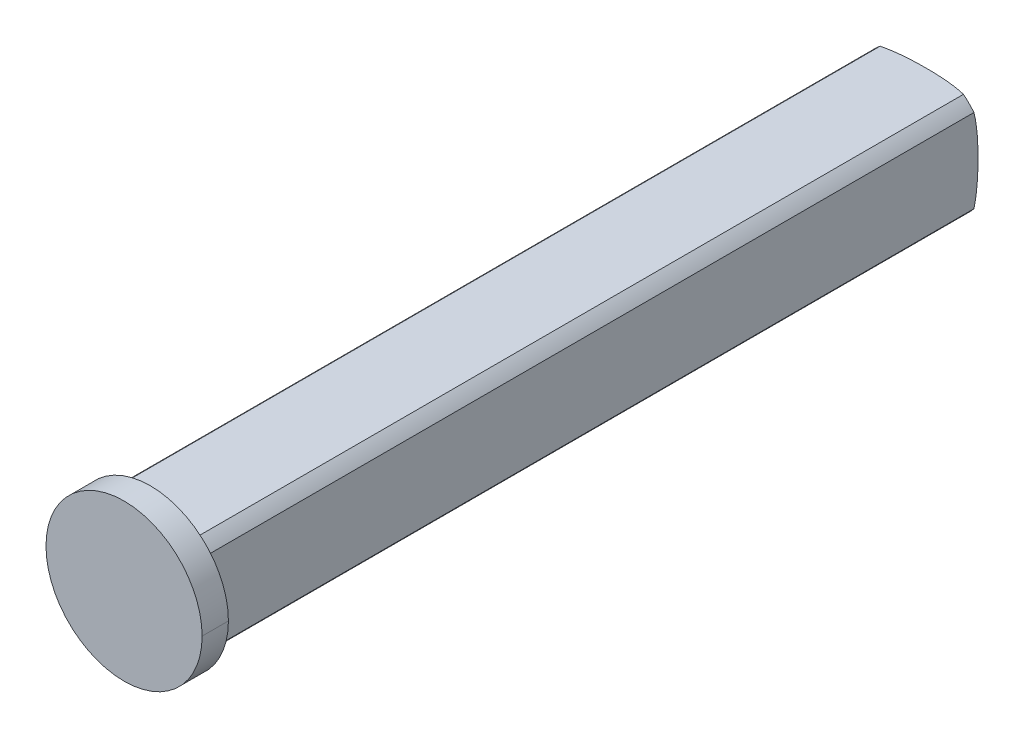
ISO-10303-21;
HEADER;
FILE_DESCRIPTION(('STEP AP214'),'2;1');
FILE_NAME('part.step','',(''),(''),'','','');
FILE_SCHEMA(('AUTOMOTIVE_DESIGN { 1 0 10303 214 1 1 1 1 }'));
ENDSEC;
DATA;
#1=APPLICATION_CONTEXT('core data for automotive mechanical design processes');
#2=APPLICATION_PROTOCOL_DEFINITION('international standard','automotive_design',2000,#1);
#3=PRODUCT_CONTEXT('',#1,'mechanical');
#4=PRODUCT('Part','Part','',(#3));
#5=PRODUCT_RELATED_PRODUCT_CATEGORY('part','',(#4));
#6=PRODUCT_DEFINITION_FORMATION('','',#4);
#7=PRODUCT_DEFINITION_CONTEXT('part definition',#1,'design');
#8=PRODUCT_DEFINITION('design','',#6,#7);
#9=PRODUCT_DEFINITION_SHAPE('','',#8);
#10=(LENGTH_UNIT() NAMED_UNIT(*) SI_UNIT(.MILLI.,.METRE.));
#11=(NAMED_UNIT(*) PLANE_ANGLE_UNIT() SI_UNIT($,.RADIAN.));
#12=(NAMED_UNIT(*) SI_UNIT($,.STERADIAN.) SOLID_ANGLE_UNIT());
#13=UNCERTAINTY_MEASURE_WITH_UNIT(LENGTH_MEASURE(1.E-05),#10,'distance_accuracy_value','');
#14=(GEOMETRIC_REPRESENTATION_CONTEXT(3) GLOBAL_UNCERTAINTY_ASSIGNED_CONTEXT((#13)) GLOBAL_UNIT_ASSIGNED_CONTEXT((#10,
#11,#12)) REPRESENTATION_CONTEXT('',''));
#15=CARTESIAN_POINT('',(0.,0.,0.));
#16=DIRECTION('',(0.,0.,1.));
#17=DIRECTION('',(1.,0.,0.));
#18=AXIS2_PLACEMENT_3D('',#15,#16,#17);
#19=CARTESIAN_POINT('',(0.,0.,0.));
#20=DIRECTION('',(0.,0.,1.));
#21=DIRECTION('',(1.,0.,0.));
#22=AXIS2_PLACEMENT_3D('',#19,#20,#21);
#23=PLANE('',#22);
#24=CARTESIAN_POINT('',(0.,0.,0.));
#25=DIRECTION('',(0.,0.,1.));
#26=DIRECTION('',(1.,0.,0.));
#27=AXIS2_PLACEMENT_3D('',#24,#25,#26);
#28=CIRCLE('',#27,2.375);
#29=CARTESIAN_POINT('',(-2.375,0.,0.));
#30=VERTEX_POINT('',#29);
#31=CARTESIAN_POINT('',(2.375,0.,0.));
#32=VERTEX_POINT('',#31);
#33=EDGE_CURVE('P0_E10',#30,#32,#28,.T.);
#34=ORIENTED_EDGE('',*,*,#33,.F.);
#35=CARTESIAN_POINT('',(0.,0.,0.));
#36=DIRECTION('',(0.,0.,1.));
#37=DIRECTION('',(1.,0.,0.));
#38=AXIS2_PLACEMENT_3D('',#35,#36,#37);
#39=CIRCLE('',#38,2.375);
#40=EDGE_CURVE('P0_E64',#32,#30,#39,.T.);
#41=ORIENTED_EDGE('',*,*,#40,.F.);
#42=EDGE_LOOP('',(#34,#41));
#43=FACE_BOUND('',#42,.T.);
#44=ADVANCED_FACE('P0_F16',(#43),#23,.F.);
#45=CARTESIAN_POINT('',(0.,0.,0.8));
#46=DIRECTION('',(0.,0.,1.));
#47=DIRECTION('',(1.,0.,0.));
#48=AXIS2_PLACEMENT_3D('',#45,#46,#47);
#49=PLANE('',#48);
#50=CARTESIAN_POINT('',(0.,0.,0.8));
#51=DIRECTION('',(0.,0.,1.));
#52=DIRECTION('',(1.,0.,0.));
#53=AXIS2_PLACEMENT_3D('',#50,#51,#52);
#54=CIRCLE('',#53,2.375);
#55=CARTESIAN_POINT('',(-2.375,0.,0.8));
#56=VERTEX_POINT('',#55);
#57=CARTESIAN_POINT('',(2.375,0.,0.8));
#58=VERTEX_POINT('',#57);
#59=EDGE_CURVE('P0_E25',#56,#58,#54,.T.);
#60=ORIENTED_EDGE('',*,*,#59,.T.);
#61=CARTESIAN_POINT('',(0.,0.,0.8));
#62=DIRECTION('',(0.,0.,1.));
#63=DIRECTION('',(1.,0.,0.));
#64=AXIS2_PLACEMENT_3D('',#61,#62,#63);
#65=CIRCLE('',#64,2.375);
#66=EDGE_CURVE('P0_E63',#58,#56,#65,.T.);
#67=ORIENTED_EDGE('',*,*,#66,.T.);
#68=EDGE_LOOP('',(#60,#67));
#69=FACE_BOUND('',#68,.T.);
#70=ADVANCED_FACE('P0_F67',(#69),#49,.T.);
#71=CARTESIAN_POINT('',(0.,0.,0.8));
#72=DIRECTION('',(0.,0.,-1.));
#73=DIRECTION('',(-1.,0.,0.));
#74=AXIS2_PLACEMENT_3D('',#71,#72,#73);
#75=CYLINDRICAL_SURFACE('',#74,2.375);
#76=DIRECTION('',(0.,0.,-1.));
#77=VECTOR('',#76,1.);
#78=CARTESIAN_POINT('',(2.375,0.,0.8));
#79=LINE('',#78,#77);
#80=EDGE_CURVE('P0_E57',#58,#32,#79,.T.);
#81=ORIENTED_EDGE('',*,*,#80,.F.);
#82=ORIENTED_EDGE('',*,*,#59,.F.);
#83=DIRECTION('',(0.,0.,-1.));
#84=VECTOR('',#83,1.);
#85=CARTESIAN_POINT('',(-2.375,0.,0.8));
#86=LINE('',#85,#84);
#87=EDGE_CURVE('P0_E54',#56,#30,#86,.T.);
#88=ORIENTED_EDGE('',*,*,#87,.T.);
#89=ORIENTED_EDGE('',*,*,#33,.T.);
#90=EDGE_LOOP('',(#81,#82,#88,#89));
#91=FACE_BOUND('',#90,.T.);
#92=ADVANCED_FACE('P0_F53',(#91),#75,.T.);
#93=CARTESIAN_POINT('',(0.,0.,0.8));
#94=DIRECTION('',(0.,0.,-1.));
#95=DIRECTION('',(-1.,0.,0.));
#96=AXIS2_PLACEMENT_3D('',#93,#94,#95);
#97=CYLINDRICAL_SURFACE('',#96,2.375);
#98=ORIENTED_EDGE('',*,*,#66,.F.);
#99=ORIENTED_EDGE('',*,*,#80,.T.);
#100=ORIENTED_EDGE('',*,*,#40,.T.);
#101=ORIENTED_EDGE('',*,*,#87,.F.);
#102=EDGE_LOOP('',(#98,#99,#100,#101));
#103=FACE_BOUND('',#102,.T.);
#104=ADVANCED_FACE('P0_F62',(#103),#97,.T.);
#105=CLOSED_SHELL('',(#44,#70,#92,#104));
#106=MANIFOLD_SOLID_BREP('P0_B1',#105);
#107=CARTESIAN_POINT('',(0.,0.,-23.622));
#108=DIRECTION('',(0.,0.,1.));
#109=DIRECTION('',(1.,0.,0.));
#110=AXIS2_PLACEMENT_3D('',#107,#108,#109);
#111=CYLINDRICAL_SURFACE('',#110,2.032);
#112=DIRECTION('',(0.,0.,-1.));
#113=VECTOR('',#112,1.);
#114=CARTESIAN_POINT('',(1.5875,1.26841150657032,-23.622));
#115=LINE('',#114,#113);
#116=CARTESIAN_POINT('',(1.5875,1.26841150657032,0.));
#117=VERTEX_POINT('',#116);
#118=CARTESIAN_POINT('',(1.5875,1.26841150657032,-23.470919142098));
#119=VERTEX_POINT('',#118);
#120=EDGE_CURVE('P1_E333',#117,#119,#115,.T.);
#121=ORIENTED_EDGE('',*,*,#120,.T.);
#122=CARTESIAN_POINT('',(0.,0.,-23.470919142098));
#123=DIRECTION('',(0.,0.,1.));
#124=DIRECTION('',(1.,0.,0.));
#125=AXIS2_PLACEMENT_3D('',#122,#123,#124);
#126=CIRCLE('',#125,2.032);
#127=CARTESIAN_POINT('',(1.26841150657032,1.5875,-23.470919142098));
#128=VERTEX_POINT('',#127);
#129=EDGE_CURVE('P1_E154',#119,#128,#126,.T.);
#130=ORIENTED_EDGE('',*,*,#129,.T.);
#131=DIRECTION('',(0.,0.,1.));
#132=VECTOR('',#131,1.);
#133=CARTESIAN_POINT('',(1.26841150657032,1.5875,-23.622));
#134=LINE('',#133,#132);
#135=CARTESIAN_POINT('',(1.26841150657032,1.5875,0.));
#136=VERTEX_POINT('',#135);
#137=EDGE_CURVE('P1_E142',#128,#136,#134,.T.);
#138=ORIENTED_EDGE('',*,*,#137,.T.);
#139=CARTESIAN_POINT('',(0.,0.,0.));
#140=DIRECTION('',(0.,0.,1.));
#141=DIRECTION('',(1.,0.,0.));
#142=AXIS2_PLACEMENT_3D('',#139,#140,#141);
#143=CIRCLE('',#142,2.032);
#144=EDGE_CURVE('P1_E309',#117,#136,#143,.T.);
#145=ORIENTED_EDGE('',*,*,#144,.F.);
#146=EDGE_LOOP('',(#121,#130,#138,#145));
#147=FACE_BOUND('',#146,.T.);
#148=ADVANCED_FACE('P1_F17',(#147),#111,.T.);
#149=CARTESIAN_POINT('',(0.,0.,-23.622));
#150=DIRECTION('',(0.,0.,1.));
#151=DIRECTION('',(1.,0.,0.));
#152=AXIS2_PLACEMENT_3D('',#149,#150,#151);
#153=CYLINDRICAL_SURFACE('',#152,2.032);
#154=DIRECTION('',(0.,0.,1.));
#155=VECTOR('',#154,1.);
#156=CARTESIAN_POINT('',(-1.5875,1.26841150657032,-23.622));
#157=LINE('',#156,#155);
#158=CARTESIAN_POINT('',(-1.5875,1.26841150657032,-23.470919142098));
#159=VERTEX_POINT('',#158);
#160=CARTESIAN_POINT('',(-1.5875,1.26841150657032,0.));
#161=VERTEX_POINT('',#160);
#162=EDGE_CURVE('P1_E295',#159,#161,#157,.T.);
#163=ORIENTED_EDGE('',*,*,#162,.T.);
#164=CARTESIAN_POINT('',(0.,0.,0.));
#165=DIRECTION('',(0.,0.,1.));
#166=DIRECTION('',(1.,0.,0.));
#167=AXIS2_PLACEMENT_3D('',#164,#165,#166);
#168=CIRCLE('',#167,2.032);
#169=CARTESIAN_POINT('',(-1.26841150657032,1.5875,0.));
#170=VERTEX_POINT('',#169);
#171=EDGE_CURVE('P1_E43',#170,#161,#168,.T.);
#172=ORIENTED_EDGE('',*,*,#171,.F.);
#173=DIRECTION('',(0.,0.,-1.));
#174=VECTOR('',#173,1.);
#175=CARTESIAN_POINT('',(-1.26841150657032,1.5875,-23.622));
#176=LINE('',#175,#174);
#177=CARTESIAN_POINT('',(-1.26841150657032,1.5875,-23.470919142098));
#178=VERTEX_POINT('',#177);
#179=EDGE_CURVE('P1_E132',#170,#178,#176,.T.);
#180=ORIENTED_EDGE('',*,*,#179,.T.);
#181=CARTESIAN_POINT('',(0.,0.,-23.470919142098));
#182=DIRECTION('',(0.,0.,1.));
#183=DIRECTION('',(1.,0.,0.));
#184=AXIS2_PLACEMENT_3D('',#181,#182,#183);
#185=CIRCLE('',#184,2.032);
#186=EDGE_CURVE('P1_E136',#178,#159,#185,.T.);
#187=ORIENTED_EDGE('',*,*,#186,.T.);
#188=EDGE_LOOP('',(#163,#172,#180,#187));
#189=FACE_BOUND('',#188,.T.);
#190=ADVANCED_FACE('P1_F134',(#189),#153,.T.);
#191=CARTESIAN_POINT('',(0.,0.,-23.622));
#192=DIRECTION('',(0.,0.,1.));
#193=DIRECTION('',(1.,0.,0.));
#194=AXIS2_PLACEMENT_3D('',#191,#192,#193);
#195=CYLINDRICAL_SURFACE('',#194,2.032);
#196=DIRECTION('',(0.,0.,-1.));
#197=VECTOR('',#196,1.);
#198=CARTESIAN_POINT('',(-1.5875,-1.26841150657032,-23.622));
#199=LINE('',#198,#197);
#200=CARTESIAN_POINT('',(-1.5875,-1.26841150657032,0.));
#201=VERTEX_POINT('',#200);
#202=CARTESIAN_POINT('',(-1.5875,-1.26841150657032,-23.470919142098));
#203=VERTEX_POINT('',#202);
#204=EDGE_CURVE('P1_E374',#201,#203,#199,.T.);
#205=ORIENTED_EDGE('',*,*,#204,.T.);
#206=CARTESIAN_POINT('',(0.,0.,-23.470919142098));
#207=DIRECTION('',(0.,0.,1.));
#208=DIRECTION('',(1.,0.,0.));
#209=AXIS2_PLACEMENT_3D('',#206,#207,#208);
#210=CIRCLE('',#209,2.032);
#211=CARTESIAN_POINT('',(-1.26841150657032,-1.5875,-23.470919142098));
#212=VERTEX_POINT('',#211);
#213=EDGE_CURVE('P1_E11',#203,#212,#210,.T.);
#214=ORIENTED_EDGE('',*,*,#213,.T.);
#215=DIRECTION('',(0.,0.,1.));
#216=VECTOR('',#215,1.);
#217=CARTESIAN_POINT('',(-1.26841150657032,-1.5875,-23.622));
#218=LINE('',#217,#216);
#219=CARTESIAN_POINT('',(-1.26841150657032,-1.5875,0.));
#220=VERTEX_POINT('',#219);
#221=EDGE_CURVE('P1_E249',#212,#220,#218,.T.);
#222=ORIENTED_EDGE('',*,*,#221,.T.);
#223=CARTESIAN_POINT('',(0.,0.,0.));
#224=DIRECTION('',(0.,0.,1.));
#225=DIRECTION('',(1.,0.,0.));
#226=AXIS2_PLACEMENT_3D('',#223,#224,#225);
#227=CIRCLE('',#226,2.032);
#228=EDGE_CURVE('P1_E343',#201,#220,#227,.T.);
#229=ORIENTED_EDGE('',*,*,#228,.F.);
#230=EDGE_LOOP('',(#205,#214,#222,#229));
#231=FACE_BOUND('',#230,.T.);
#232=ADVANCED_FACE('P1_F193',(#231),#195,.T.);
#233=CARTESIAN_POINT('',(0.,0.,-23.622));
#234=DIRECTION('',(0.,0.,1.));
#235=DIRECTION('',(1.,0.,0.));
#236=AXIS2_PLACEMENT_3D('',#233,#234,#235);
#237=CYLINDRICAL_SURFACE('',#236,2.032);
#238=DIRECTION('',(0.,0.,-1.));
#239=VECTOR('',#238,1.);
#240=CARTESIAN_POINT('',(1.26841150657032,-1.5875,-23.622));
#241=LINE('',#240,#239);
#242=CARTESIAN_POINT('',(1.26841150657032,-1.5875,0.));
#243=VERTEX_POINT('',#242);
#244=CARTESIAN_POINT('',(1.26841150657032,-1.5875,-23.470919142098));
#245=VERTEX_POINT('',#244);
#246=EDGE_CURVE('P1_E257',#243,#245,#241,.T.);
#247=ORIENTED_EDGE('',*,*,#246,.T.);
#248=CARTESIAN_POINT('',(0.,0.,-23.470919142098));
#249=DIRECTION('',(0.,0.,1.));
#250=DIRECTION('',(1.,0.,0.));
#251=AXIS2_PLACEMENT_3D('',#248,#249,#250);
#252=CIRCLE('',#251,2.032);
#253=CARTESIAN_POINT('',(1.5875,-1.26841150657032,-23.470919142098));
#254=VERTEX_POINT('',#253);
#255=EDGE_CURVE('P1_E28',#245,#254,#252,.T.);
#256=ORIENTED_EDGE('',*,*,#255,.T.);
#257=DIRECTION('',(0.,0.,1.));
#258=VECTOR('',#257,1.);
#259=CARTESIAN_POINT('',(1.5875,-1.26841150657032,-23.622));
#260=LINE('',#259,#258);
#261=CARTESIAN_POINT('',(1.5875,-1.26841150657032,0.));
#262=VERTEX_POINT('',#261);
#263=EDGE_CURVE('P1_E271',#254,#262,#260,.T.);
#264=ORIENTED_EDGE('',*,*,#263,.T.);
#265=CARTESIAN_POINT('',(0.,0.,0.));
#266=DIRECTION('',(0.,0.,1.));
#267=DIRECTION('',(1.,0.,0.));
#268=AXIS2_PLACEMENT_3D('',#265,#266,#267);
#269=CIRCLE('',#268,2.032);
#270=EDGE_CURVE('P1_E314',#243,#262,#269,.T.);
#271=ORIENTED_EDGE('',*,*,#270,.F.);
#272=EDGE_LOOP('',(#247,#256,#264,#271));
#273=FACE_BOUND('',#272,.T.);
#274=ADVANCED_FACE('P1_F337',(#273),#237,.T.);
#275=CARTESIAN_POINT('',(-1.5875,1.5875,-23.622));
#276=DIRECTION('',(0.,0.,-1.));
#277=DIRECTION('',(0.,-1.,0.));
#278=AXIS2_PLACEMENT_3D('',#275,#276,#277);
#279=PLANE('',#278);
#280=CARTESIAN_POINT('',(0.,0.,-23.622));
#281=DIRECTION('',(0.,0.,1.));
#282=DIRECTION('',(1.,0.,0.));
#283=AXIS2_PLACEMENT_3D('',#280,#281,#282);
#284=CIRCLE('',#283,1.24506403026729);
#285=CARTESIAN_POINT('',(1.24506403026729,0.,-23.622));
#286=VERTEX_POINT('',#285);
#287=CARTESIAN_POINT('',(-1.24506403026729,0.,-23.622));
#288=VERTEX_POINT('',#287);
#289=EDGE_CURVE('P1_E350',#286,#288,#284,.T.);
#290=ORIENTED_EDGE('',*,*,#289,.F.);
#291=CARTESIAN_POINT('',(0.,0.,-23.622));
#292=DIRECTION('',(0.,0.,1.));
#293=DIRECTION('',(1.,0.,0.));
#294=AXIS2_PLACEMENT_3D('',#291,#292,#293);
#295=CIRCLE('',#294,1.24506403026729);
#296=EDGE_CURVE('P1_E117',#288,#286,#295,.T.);
#297=ORIENTED_EDGE('',*,*,#296,.F.);
#298=EDGE_LOOP('',(#290,#297));
#299=FACE_BOUND('',#298,.T.);
#300=ADVANCED_FACE('P1_F19',(#299),#279,.T.);
#301=CARTESIAN_POINT('',(0.,0.,-21.497));
#302=DIRECTION('',(0.,0.,1.));
#303=DIRECTION('',(1.,0.,0.));
#304=AXIS2_PLACEMENT_3D('',#301,#302,#303);
#305=DEGENERATE_TOROIDAL_SURFACE('',#304,1.24506403026729,2.125,.T.);
#306=CARTESIAN_POINT('',(-1.24506403026729,0.,-21.497));
#307=DIRECTION('',(0.,1.,0.));
#308=DIRECTION('',(-1.,0.,0.));
#309=AXIS2_PLACEMENT_3D('',#306,#307,#308);
#310=CIRCLE('',#309,2.125);
#311=CARTESIAN_POINT('',(-1.5875,0.,-23.5942273616928));
#312=VERTEX_POINT('',#311);
#313=EDGE_CURVE('P1_E170',#288,#312,#310,.T.);
#314=ORIENTED_EDGE('',*,*,#313,.F.);
#315=ORIENTED_EDGE('',*,*,#296,.T.);
#316=CARTESIAN_POINT('',(1.24506403026729,0.,-21.497));
#317=DIRECTION('',(0.,-1.,0.));
#318=DIRECTION('',(0.,0.,-1.));
#319=AXIS2_PLACEMENT_3D('',#316,#317,#318);
#320=CIRCLE('',#319,2.125);
#321=CARTESIAN_POINT('',(1.5875,0.,-23.5942273616928));
#322=VERTEX_POINT('',#321);
#323=EDGE_CURVE('P1_E292',#286,#322,#320,.T.);
#324=ORIENTED_EDGE('',*,*,#323,.T.);
#325=CARTESIAN_POINT('',(1.5875,-1.26841150657032,-23.470919142098));
#326=CARTESIAN_POINT('',(1.5875,-0.987077094935139,-23.5409306391293));
#327=CARTESIAN_POINT('',(1.5875,-0.639530459017569,-23.5701819538897));
#328=CARTESIAN_POINT('',(1.5875,-0.353837297539494,-23.5942273616928));
#329=CARTESIAN_POINT('',(1.5875,0.,-23.5942273616928));
#330=B_SPLINE_CURVE_WITH_KNOTS('',2,(#325,#326,#327,#328,#329),.UNSPECIFIED.,.F.,.F.,(3,2,3),
(0.,0.5,1.),.UNSPECIFIED.);
#331=EDGE_CURVE('P1_E301',#254,#322,#330,.T.);
#332=ORIENTED_EDGE('',*,*,#331,.F.);
#333=ORIENTED_EDGE('',*,*,#255,.F.);
#334=CARTESIAN_POINT('',(-1.26841150657032,-1.5875,-23.470919142098));
#335=CARTESIAN_POINT('',(-0.770338232190256,-1.5875,-23.5948672057848));
#336=CARTESIAN_POINT('',(0.00849337593367507,-1.5875,-23.5942236517902));
#337=CARTESIAN_POINT('',(0.775470990418335,-1.5875,-23.5935898928334));
#338=CARTESIAN_POINT('',(1.26841150657033,-1.5875,-23.470919142098));
#339=B_SPLINE_CURVE_WITH_KNOTS('',2,(#334,#335,#336,#337,#338),.UNSPECIFIED.,.F.,.F.,(3,2,3),
(0.,0.5,1.),.UNSPECIFIED.);
#340=EDGE_CURVE('P1_E253',#212,#245,#339,.T.);
#341=ORIENTED_EDGE('',*,*,#340,.F.);
#342=ORIENTED_EDGE('',*,*,#213,.F.);
#343=CARTESIAN_POINT('',(-1.5875,0.,-23.5942273616928));
#344=CARTESIAN_POINT('',(-1.5875,-0.353179957337756,-23.5942273616928));
#345=CARTESIAN_POINT('',(-1.5875,-0.639529322286498,-23.5701820494506));
#346=CARTESIAN_POINT('',(-1.5875,-0.986669843205379,-23.54103198579));
#347=CARTESIAN_POINT('',(-1.5875,-1.26841150657032,-23.470919142098));
#348=B_SPLINE_CURVE_WITH_KNOTS('',2,(#343,#344,#345,#346,#347),.UNSPECIFIED.,.F.,.F.,(3,2,3),
(0.,0.5,1.),.UNSPECIFIED.);
#349=EDGE_CURVE('P1_E209',#312,#203,#348,.T.);
#350=ORIENTED_EDGE('',*,*,#349,.F.);
#351=EDGE_LOOP('',(#314,#315,#324,#332,#333,#341,#342,#350));
#352=FACE_BOUND('',#351,.T.);
#353=ADVANCED_FACE('P1_F215',(#352),#305,.T.);
#354=CARTESIAN_POINT('',(-1.5875,1.5875,0.));
#355=DIRECTION('',(0.,0.,-1.));
#356=DIRECTION('',(0.,-1.,0.));
#357=AXIS2_PLACEMENT_3D('',#354,#355,#356);
#358=PLANE('',#357);
#359=ORIENTED_EDGE('',*,*,#171,.T.);
#360=DIRECTION('',(0.,-1.,0.));
#361=VECTOR('',#360,1.);
#362=CARTESIAN_POINT('',(-1.5875,-1.5875,0.));
#363=LINE('',#362,#361);
#364=EDGE_CURVE('P1_E254',#161,#201,#363,.T.);
#365=ORIENTED_EDGE('',*,*,#364,.T.);
#366=ORIENTED_EDGE('',*,*,#228,.T.);
#367=DIRECTION('',(1.,0.,0.));
#368=VECTOR('',#367,1.);
#369=CARTESIAN_POINT('',(-1.5875,-1.5875,0.));
#370=LINE('',#369,#368);
#371=EDGE_CURVE('P1_E260',#220,#243,#370,.T.);
#372=ORIENTED_EDGE('',*,*,#371,.T.);
#373=ORIENTED_EDGE('',*,*,#270,.T.);
#374=DIRECTION('',(0.,1.,0.));
#375=VECTOR('',#374,1.);
#376=CARTESIAN_POINT('',(1.5875,-1.5875,0.));
#377=LINE('',#376,#375);
#378=EDGE_CURVE('P1_E317',#262,#117,#377,.T.);
#379=ORIENTED_EDGE('',*,*,#378,.T.);
#380=ORIENTED_EDGE('',*,*,#144,.T.);
#381=DIRECTION('',(-1.,0.,0.));
#382=VECTOR('',#381,1.);
#383=CARTESIAN_POINT('',(-1.5875,1.5875,0.));
#384=LINE('',#383,#382);
#385=EDGE_CURVE('P1_E141',#136,#170,#384,.T.);
#386=ORIENTED_EDGE('',*,*,#385,.T.);
#387=EDGE_LOOP('',(#359,#365,#366,#372,#373,#379,#380,#386));
#388=FACE_BOUND('',#387,.T.);
#389=ADVANCED_FACE('P1_F225',(#388),#358,.F.);
#390=CARTESIAN_POINT('',(-1.5875,1.5875,0.));
#391=DIRECTION('',(0.,-1.,0.));
#392=DIRECTION('',(0.,0.,-1.));
#393=AXIS2_PLACEMENT_3D('',#390,#391,#392);
#394=PLANE('',#393);
#395=ORIENTED_EDGE('',*,*,#137,.F.);
#396=CARTESIAN_POINT('',(1.26841150657033,1.5875,-23.470919142098));
#397=CARTESIAN_POINT('',(0.770338232190255,1.5875,-23.5948672057848));
#398=CARTESIAN_POINT('',(-0.00849337593367486,1.5875,-23.5942236517902));
#399=CARTESIAN_POINT('',(-0.775470990418336,1.5875,-23.5935898928334));
#400=CARTESIAN_POINT('',(-1.26841150657032,1.5875,-23.470919142098));
#401=B_SPLINE_CURVE_WITH_KNOTS('',2,(#396,#397,#398,#399,#400),.UNSPECIFIED.,.F.,.F.,(3,2,3),
(0.,0.5,1.),.UNSPECIFIED.);
#402=EDGE_CURVE('P1_E145',#128,#178,#401,.T.);
#403=ORIENTED_EDGE('',*,*,#402,.T.);
#404=ORIENTED_EDGE('',*,*,#179,.F.);
#405=ORIENTED_EDGE('',*,*,#385,.F.);
#406=EDGE_LOOP('',(#395,#403,#404,#405));
#407=FACE_BOUND('',#406,.T.);
#408=ADVANCED_FACE('P1_F147',(#407),#394,.F.);
#409=CARTESIAN_POINT('',(1.5875,-1.5875,0.));
#410=DIRECTION('',(-1.,0.,0.));
#411=DIRECTION('',(0.,0.,1.));
#412=AXIS2_PLACEMENT_3D('',#409,#410,#411);
#413=PLANE('',#412);
#414=ORIENTED_EDGE('',*,*,#263,.F.);
#415=ORIENTED_EDGE('',*,*,#331,.T.);
#416=CARTESIAN_POINT('',(1.5875,0.,-23.5942273616928));
#417=CARTESIAN_POINT('',(1.5875,0.35317995733781,-23.5942273616928));
#418=CARTESIAN_POINT('',(1.5875,0.6395293222865,-23.5701820494506));
#419=CARTESIAN_POINT('',(1.5875,0.98666984320532,-23.54103198579));
#420=CARTESIAN_POINT('',(1.5875,1.26841150657033,-23.470919142098));
#421=B_SPLINE_CURVE_WITH_KNOTS('',2,(#416,#417,#418,#419,#420),.UNSPECIFIED.,.F.,.F.,(3,2,3),
(0.,0.5,1.),.UNSPECIFIED.);
#422=EDGE_CURVE('P1_E296',#322,#119,#421,.T.);
#423=ORIENTED_EDGE('',*,*,#422,.T.);
#424=ORIENTED_EDGE('',*,*,#120,.F.);
#425=ORIENTED_EDGE('',*,*,#378,.F.);
#426=EDGE_LOOP('',(#414,#415,#423,#424,#425));
#427=FACE_BOUND('',#426,.T.);
#428=ADVANCED_FACE('P1_F226',(#427),#413,.F.);
#429=CARTESIAN_POINT('',(-1.5875,-1.5875,0.));
#430=DIRECTION('',(0.,1.,0.));
#431=DIRECTION('',(1.,0.,0.));
#432=AXIS2_PLACEMENT_3D('',#429,#430,#431);
#433=PLANE('',#432);
#434=ORIENTED_EDGE('',*,*,#221,.F.);
#435=ORIENTED_EDGE('',*,*,#340,.T.);
#436=ORIENTED_EDGE('',*,*,#246,.F.);
#437=ORIENTED_EDGE('',*,*,#371,.F.);
#438=EDGE_LOOP('',(#434,#435,#436,#437));
#439=FACE_BOUND('',#438,.T.);
#440=ADVANCED_FACE('P1_F192',(#439),#433,.F.);
#441=CARTESIAN_POINT('',(-1.5875,-1.5875,0.));
#442=DIRECTION('',(1.,0.,0.));
#443=DIRECTION('',(0.,1.,0.));
#444=AXIS2_PLACEMENT_3D('',#441,#442,#443);
#445=PLANE('',#444);
#446=ORIENTED_EDGE('',*,*,#162,.F.);
#447=CARTESIAN_POINT('',(-1.5875,1.26841150657033,-23.470919142098));
#448=CARTESIAN_POINT('',(-1.5875,0.98707709493514,-23.5409306391293));
#449=CARTESIAN_POINT('',(-1.5875,0.63953045901757,-23.5701819538897));
#450=CARTESIAN_POINT('',(-1.5875,0.353837297539495,-23.5942273616928));
#451=CARTESIAN_POINT('',(-1.5875,0.,-23.5942273616928));
#452=B_SPLINE_CURVE_WITH_KNOTS('',2,(#447,#448,#449,#450,#451),.UNSPECIFIED.,.F.,.F.,(3,2,3),
(0.,0.5,1.),.UNSPECIFIED.);
#453=EDGE_CURVE('P1_E161',#159,#312,#452,.T.);
#454=ORIENTED_EDGE('',*,*,#453,.T.);
#455=ORIENTED_EDGE('',*,*,#349,.T.);
#456=ORIENTED_EDGE('',*,*,#204,.F.);
#457=ORIENTED_EDGE('',*,*,#364,.F.);
#458=EDGE_LOOP('',(#446,#454,#455,#456,#457));
#459=FACE_BOUND('',#458,.T.);
#460=ADVANCED_FACE('P1_F183',(#459),#445,.F.);
#461=CARTESIAN_POINT('',(0.,0.,-21.497));
#462=DIRECTION('',(0.,0.,1.));
#463=DIRECTION('',(1.,0.,0.));
#464=AXIS2_PLACEMENT_3D('',#461,#462,#463);
#465=DEGENERATE_TOROIDAL_SURFACE('',#464,1.24506403026729,2.125,.T.);
#466=ORIENTED_EDGE('',*,*,#289,.T.);
#467=ORIENTED_EDGE('',*,*,#313,.T.);
#468=ORIENTED_EDGE('',*,*,#453,.F.);
#469=ORIENTED_EDGE('',*,*,#186,.F.);
#470=ORIENTED_EDGE('',*,*,#402,.F.);
#471=ORIENTED_EDGE('',*,*,#129,.F.);
#472=ORIENTED_EDGE('',*,*,#422,.F.);
#473=ORIENTED_EDGE('',*,*,#323,.F.);
#474=EDGE_LOOP('',(#466,#467,#468,#469,#470,#471,#472,#473));
#475=FACE_BOUND('',#474,.T.);
#476=ADVANCED_FACE('P1_F158',(#475),#465,.T.);
#477=CLOSED_SHELL('',(#148,#190,#232,#274,#300,#353,#389,#408,#428,#440,#460,#476));
#478=MANIFOLD_SOLID_BREP('P1_B1',#477);
#479=ADVANCED_BREP_SHAPE_REPRESENTATION('',(#18,#106,#478),#14);
#480=SHAPE_DEFINITION_REPRESENTATION(#9,#479);
ENDSEC;
END-ISO-10303-21;
